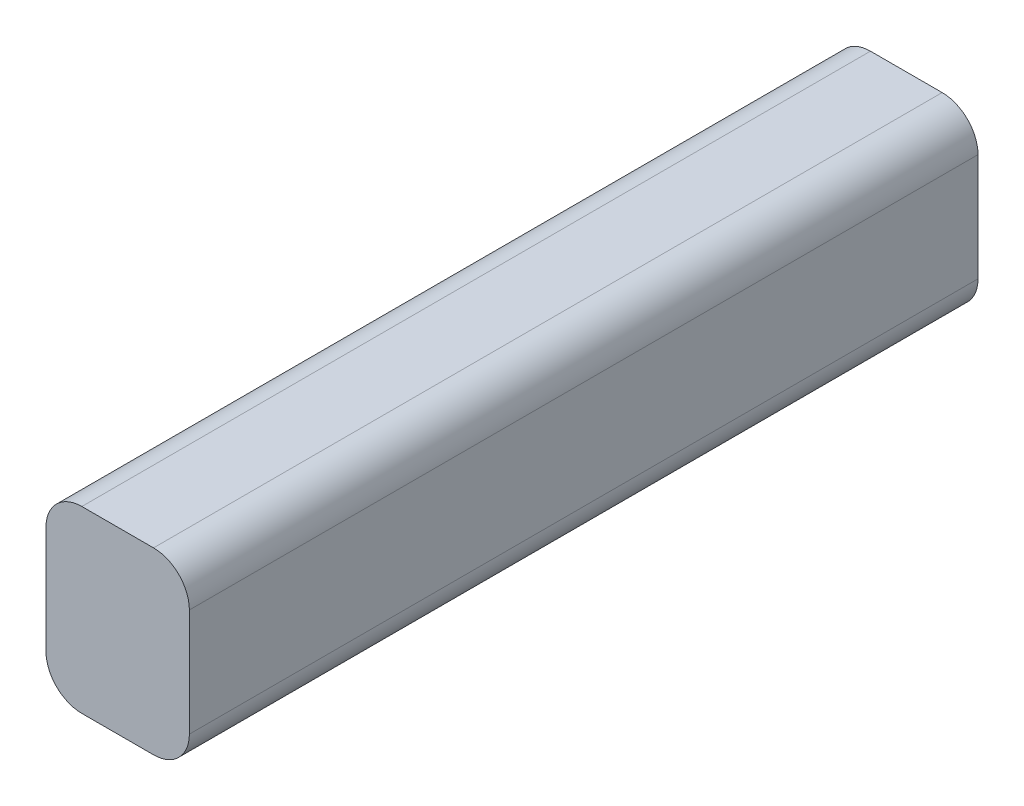
ISO-10303-21;
HEADER;
FILE_DESCRIPTION(('STEP AP214'),'2;1');
FILE_NAME('part.step','',(''),(''),'','','');
FILE_SCHEMA(('AUTOMOTIVE_DESIGN { 1 0 10303 214 1 1 1 1 }'));
ENDSEC;
DATA;
#1=APPLICATION_CONTEXT('core data for automotive mechanical design processes');
#2=APPLICATION_PROTOCOL_DEFINITION('international standard','automotive_design',2000,#1);
#3=PRODUCT_CONTEXT('',#1,'mechanical');
#4=PRODUCT('Part','Part','',(#3));
#5=PRODUCT_RELATED_PRODUCT_CATEGORY('part','',(#4));
#6=PRODUCT_DEFINITION_FORMATION('','',#4);
#7=PRODUCT_DEFINITION_CONTEXT('part definition',#1,'design');
#8=PRODUCT_DEFINITION('design','',#6,#7);
#9=PRODUCT_DEFINITION_SHAPE('','',#8);
#10=(LENGTH_UNIT() NAMED_UNIT(*) SI_UNIT(.MILLI.,.METRE.));
#11=(NAMED_UNIT(*) PLANE_ANGLE_UNIT() SI_UNIT($,.RADIAN.));
#12=(NAMED_UNIT(*) SI_UNIT($,.STERADIAN.) SOLID_ANGLE_UNIT());
#13=UNCERTAINTY_MEASURE_WITH_UNIT(LENGTH_MEASURE(1.E-05),#10,'distance_accuracy_value','');
#14=(GEOMETRIC_REPRESENTATION_CONTEXT(3) GLOBAL_UNCERTAINTY_ASSIGNED_CONTEXT((#13)) GLOBAL_UNIT_ASSIGNED_CONTEXT((#10,
#11,#12)) REPRESENTATION_CONTEXT('',''));
#15=CARTESIAN_POINT('',(0.,0.,0.));
#16=DIRECTION('',(0.,0.,1.));
#17=DIRECTION('',(1.,0.,0.));
#18=AXIS2_PLACEMENT_3D('',#15,#16,#17);
#19=CARTESIAN_POINT('',(100.,125.,1100.));
#20=DIRECTION('',(-1.,0.,0.));
#21=DIRECTION('',(0.,-1.,0.));
#22=AXIS2_PLACEMENT_3D('',#19,#20,#21);
#23=PLANE('',#22);
#24=DIRECTION('',(0.,1.,0.));
#25=VECTOR('',#24,1.);
#26=CARTESIAN_POINT('',(100.,125.,1100.));
#27=LINE('',#26,#25);
#28=CARTESIAN_POINT('',(100.,-75.,1100.));
#29=VERTEX_POINT('',#28);
#30=CARTESIAN_POINT('',(100.,75.0000000000001,1100.));
#31=VERTEX_POINT('',#30);
#32=EDGE_CURVE('E127',#29,#31,#27,.T.);
#33=ORIENTED_EDGE('',*,*,#32,.F.);
#34=DIRECTION('',(0.,0.,-1.));
#35=VECTOR('',#34,1.);
#36=CARTESIAN_POINT('',(100.,-75.,1100.));
#37=LINE('',#36,#35);
#38=CARTESIAN_POINT('',(100.,-75.,0.));
#39=VERTEX_POINT('',#38);
#40=EDGE_CURVE('E155',#29,#39,#37,.T.);
#41=ORIENTED_EDGE('',*,*,#40,.T.);
#42=DIRECTION('',(0.,1.,0.));
#43=VECTOR('',#42,1.);
#44=CARTESIAN_POINT('',(100.,125.,0.));
#45=LINE('',#44,#43);
#46=CARTESIAN_POINT('',(100.,75.0000000000001,0.));
#47=VERTEX_POINT('',#46);
#48=EDGE_CURVE('E129',#39,#47,#45,.T.);
#49=ORIENTED_EDGE('',*,*,#48,.T.);
#50=DIRECTION('',(0.,0.,-1.));
#51=VECTOR('',#50,1.);
#52=CARTESIAN_POINT('',(100.,75.0000000000001,1100.));
#53=LINE('',#52,#51);
#54=EDGE_CURVE('E150',#47,#31,#53,.F.);
#55=ORIENTED_EDGE('',*,*,#54,.T.);
#56=EDGE_LOOP('',(#33,#41,#49,#55));
#57=FACE_BOUND('',#56,.T.);
#58=ADVANCED_FACE('F36',(#57),#23,.F.);
#59=CARTESIAN_POINT('',(-100.,125.,1100.));
#60=DIRECTION('',(0.,-1.,0.));
#61=DIRECTION('',(0.,0.,-1.));
#62=AXIS2_PLACEMENT_3D('',#59,#60,#61);
#63=PLANE('',#62);
#64=DIRECTION('',(-1.,0.,0.));
#65=VECTOR('',#64,1.);
#66=CARTESIAN_POINT('',(-100.,125.,1100.));
#67=LINE('',#66,#65);
#68=CARTESIAN_POINT('',(50.,125.,1100.));
#69=VERTEX_POINT('',#68);
#70=CARTESIAN_POINT('',(-50.,125.,1100.));
#71=VERTEX_POINT('',#70);
#72=EDGE_CURVE('E167',#69,#71,#67,.T.);
#73=ORIENTED_EDGE('',*,*,#72,.F.);
#74=DIRECTION('',(0.,0.,-1.));
#75=VECTOR('',#74,1.);
#76=CARTESIAN_POINT('',(50.,125.,1100.));
#77=LINE('',#76,#75);
#78=CARTESIAN_POINT('',(50.,125.,0.));
#79=VERTEX_POINT('',#78);
#80=EDGE_CURVE('E144',#69,#79,#77,.T.);
#81=ORIENTED_EDGE('',*,*,#80,.T.);
#82=DIRECTION('',(-1.,0.,0.));
#83=VECTOR('',#82,1.);
#84=CARTESIAN_POINT('',(-100.,125.,0.));
#85=LINE('',#84,#83);
#86=CARTESIAN_POINT('',(-50.,125.,0.));
#87=VERTEX_POINT('',#86);
#88=EDGE_CURVE('E125',#79,#87,#85,.T.);
#89=ORIENTED_EDGE('',*,*,#88,.T.);
#90=DIRECTION('',(0.,0.,-1.));
#91=VECTOR('',#90,1.);
#92=CARTESIAN_POINT('',(-50.,125.,1100.));
#93=LINE('',#92,#91);
#94=EDGE_CURVE('E108',#87,#71,#93,.F.);
#95=ORIENTED_EDGE('',*,*,#94,.T.);
#96=EDGE_LOOP('',(#73,#81,#89,#95));
#97=FACE_BOUND('',#96,.T.);
#98=ADVANCED_FACE('F177',(#97),#63,.F.);
#99=CARTESIAN_POINT('',(-100.,125.,1100.));
#100=DIRECTION('',(1.,0.,0.));
#101=DIRECTION('',(0.,1.,0.));
#102=AXIS2_PLACEMENT_3D('',#99,#100,#101);
#103=PLANE('',#102);
#104=DIRECTION('',(0.,-1.,0.));
#105=VECTOR('',#104,1.);
#106=CARTESIAN_POINT('',(-100.,125.,0.));
#107=LINE('',#106,#105);
#108=CARTESIAN_POINT('',(-100.,75.0000000000001,0.));
#109=VERTEX_POINT('',#108);
#110=CARTESIAN_POINT('',(-100.,-75.,0.));
#111=VERTEX_POINT('',#110);
#112=EDGE_CURVE('E116',#109,#111,#107,.T.);
#113=ORIENTED_EDGE('',*,*,#112,.T.);
#114=DIRECTION('',(0.,0.,-1.));
#115=VECTOR('',#114,1.);
#116=CARTESIAN_POINT('',(-100.,-75.,1100.));
#117=LINE('',#116,#115);
#118=CARTESIAN_POINT('',(-100.,-75.,1100.));
#119=VERTEX_POINT('',#118);
#120=EDGE_CURVE('E140',#111,#119,#117,.F.);
#121=ORIENTED_EDGE('',*,*,#120,.T.);
#122=DIRECTION('',(0.,-1.,0.));
#123=VECTOR('',#122,1.);
#124=CARTESIAN_POINT('',(-100.,125.,1100.));
#125=LINE('',#124,#123);
#126=CARTESIAN_POINT('',(-100.,75.0000000000001,1100.));
#127=VERTEX_POINT('',#126);
#128=EDGE_CURVE('E119',#127,#119,#125,.T.);
#129=ORIENTED_EDGE('',*,*,#128,.F.);
#130=DIRECTION('',(0.,0.,-1.));
#131=VECTOR('',#130,1.);
#132=CARTESIAN_POINT('',(-100.,75.0000000000001,1100.));
#133=LINE('',#132,#131);
#134=EDGE_CURVE('E106',#127,#109,#133,.T.);
#135=ORIENTED_EDGE('',*,*,#134,.T.);
#136=EDGE_LOOP('',(#113,#121,#129,#135));
#137=FACE_BOUND('',#136,.T.);
#138=ADVANCED_FACE('F115',(#137),#103,.F.);
#139=CARTESIAN_POINT('',(-100.,-125.,1100.));
#140=DIRECTION('',(0.,1.,0.));
#141=DIRECTION('',(0.,0.,1.));
#142=AXIS2_PLACEMENT_3D('',#139,#140,#141);
#143=PLANE('',#142);
#144=DIRECTION('',(1.,0.,0.));
#145=VECTOR('',#144,1.);
#146=CARTESIAN_POINT('',(-100.,-125.,0.));
#147=LINE('',#146,#145);
#148=CARTESIAN_POINT('',(-50.,-125.,0.));
#149=VERTEX_POINT('',#148);
#150=CARTESIAN_POINT('',(50.,-125.,0.));
#151=VERTEX_POINT('',#150);
#152=EDGE_CURVE('E124',#149,#151,#147,.T.);
#153=ORIENTED_EDGE('',*,*,#152,.T.);
#154=DIRECTION('',(0.,0.,-1.));
#155=VECTOR('',#154,1.);
#156=CARTESIAN_POINT('',(50.,-125.,1100.));
#157=LINE('',#156,#155);
#158=CARTESIAN_POINT('',(50.,-125.,1100.));
#159=VERTEX_POINT('',#158);
#160=EDGE_CURVE('E44',#151,#159,#157,.F.);
#161=ORIENTED_EDGE('',*,*,#160,.T.);
#162=DIRECTION('',(1.,0.,0.));
#163=VECTOR('',#162,1.);
#164=CARTESIAN_POINT('',(-100.,-125.,1100.));
#165=LINE('',#164,#163);
#166=CARTESIAN_POINT('',(-50.,-125.,1100.));
#167=VERTEX_POINT('',#166);
#168=EDGE_CURVE('E120',#167,#159,#165,.T.);
#169=ORIENTED_EDGE('',*,*,#168,.F.);
#170=DIRECTION('',(0.,0.,-1.));
#171=VECTOR('',#170,1.);
#172=CARTESIAN_POINT('',(-50.,-125.,1100.));
#173=LINE('',#172,#171);
#174=EDGE_CURVE('E136',#167,#149,#173,.T.);
#175=ORIENTED_EDGE('',*,*,#174,.T.);
#176=EDGE_LOOP('',(#153,#161,#169,#175));
#177=FACE_BOUND('',#176,.T.);
#178=ADVANCED_FACE('F182',(#177),#143,.F.);
#179=CARTESIAN_POINT('',(0.,0.,1100.));
#180=DIRECTION('',(0.,0.,1.));
#181=DIRECTION('',(1.,0.,0.));
#182=AXIS2_PLACEMENT_3D('',#179,#180,#181);
#183=PLANE('',#182);
#184=ORIENTED_EDGE('',*,*,#168,.T.);
#185=CARTESIAN_POINT('',(50.,-75.,1100.));
#186=DIRECTION('',(0.,0.,1.));
#187=DIRECTION('',(1.,0.,0.));
#188=AXIS2_PLACEMENT_3D('',#185,#186,#187);
#189=CIRCLE('',#188,50.);
#190=EDGE_CURVE('E11',#159,#29,#189,.T.);
#191=ORIENTED_EDGE('',*,*,#190,.T.);
#192=ORIENTED_EDGE('',*,*,#32,.T.);
#193=CARTESIAN_POINT('',(50.,75.0000000000001,1100.));
#194=DIRECTION('',(0.,0.,1.));
#195=DIRECTION('',(1.,0.,0.));
#196=AXIS2_PLACEMENT_3D('',#193,#194,#195);
#197=CIRCLE('',#196,50.);
#198=EDGE_CURVE('E153',#31,#69,#197,.T.);
#199=ORIENTED_EDGE('',*,*,#198,.T.);
#200=ORIENTED_EDGE('',*,*,#72,.T.);
#201=CARTESIAN_POINT('',(-50.,75.0000000000001,1100.));
#202=DIRECTION('',(0.,0.,1.));
#203=DIRECTION('',(1.,0.,0.));
#204=AXIS2_PLACEMENT_3D('',#201,#202,#203);
#205=CIRCLE('',#204,50.);
#206=EDGE_CURVE('E134',#71,#127,#205,.T.);
#207=ORIENTED_EDGE('',*,*,#206,.T.);
#208=ORIENTED_EDGE('',*,*,#128,.T.);
#209=CARTESIAN_POINT('',(-50.,-75.,1100.));
#210=DIRECTION('',(0.,0.,1.));
#211=DIRECTION('',(1.,0.,0.));
#212=AXIS2_PLACEMENT_3D('',#209,#210,#211);
#213=CIRCLE('',#212,50.);
#214=EDGE_CURVE('E142',#119,#167,#213,.T.);
#215=ORIENTED_EDGE('',*,*,#214,.T.);
#216=EDGE_LOOP('',(#184,#191,#192,#199,#200,#207,#208,#215));
#217=FACE_BOUND('',#216,.T.);
#218=ADVANCED_FACE('F170',(#217),#183,.T.);
#219=CARTESIAN_POINT('',(0.,0.,0.));
#220=DIRECTION('',(0.,0.,1.));
#221=DIRECTION('',(1.,0.,0.));
#222=AXIS2_PLACEMENT_3D('',#219,#220,#221);
#223=PLANE('',#222);
#224=ORIENTED_EDGE('',*,*,#48,.F.);
#225=CARTESIAN_POINT('',(50.,-75.,0.));
#226=DIRECTION('',(0.,0.,1.));
#227=DIRECTION('',(1.,0.,0.));
#228=AXIS2_PLACEMENT_3D('',#225,#226,#227);
#229=CIRCLE('',#228,50.);
#230=EDGE_CURVE('E58',#39,#151,#229,.F.);
#231=ORIENTED_EDGE('',*,*,#230,.T.);
#232=ORIENTED_EDGE('',*,*,#152,.F.);
#233=CARTESIAN_POINT('',(-50.,-75.,0.));
#234=DIRECTION('',(0.,0.,1.));
#235=DIRECTION('',(1.,0.,0.));
#236=AXIS2_PLACEMENT_3D('',#233,#234,#235);
#237=CIRCLE('',#236,50.);
#238=EDGE_CURVE('E123',#149,#111,#237,.F.);
#239=ORIENTED_EDGE('',*,*,#238,.T.);
#240=ORIENTED_EDGE('',*,*,#112,.F.);
#241=CARTESIAN_POINT('',(-50.,75.0000000000001,0.));
#242=DIRECTION('',(0.,0.,1.));
#243=DIRECTION('',(1.,0.,0.));
#244=AXIS2_PLACEMENT_3D('',#241,#242,#243);
#245=CIRCLE('',#244,50.);
#246=EDGE_CURVE('E102',#109,#87,#245,.F.);
#247=ORIENTED_EDGE('',*,*,#246,.T.);
#248=ORIENTED_EDGE('',*,*,#88,.F.);
#249=CARTESIAN_POINT('',(50.,75.0000000000001,0.));
#250=DIRECTION('',(0.,0.,1.));
#251=DIRECTION('',(1.,0.,0.));
#252=AXIS2_PLACEMENT_3D('',#249,#250,#251);
#253=CIRCLE('',#252,50.);
#254=EDGE_CURVE('E147',#79,#47,#253,.F.);
#255=ORIENTED_EDGE('',*,*,#254,.T.);
#256=EDGE_LOOP('',(#224,#231,#232,#239,#240,#247,#248,#255));
#257=FACE_BOUND('',#256,.T.);
#258=ADVANCED_FACE('F122',(#257),#223,.F.);
#259=CARTESIAN_POINT('',(-50.,75.0000000000001,1100.));
#260=DIRECTION('',(0.,0.,-1.));
#261=DIRECTION('',(-1.,0.,0.));
#262=AXIS2_PLACEMENT_3D('',#259,#260,#261);
#263=CYLINDRICAL_SURFACE('',#262,50.);
#264=ORIENTED_EDGE('',*,*,#206,.F.);
#265=ORIENTED_EDGE('',*,*,#94,.F.);
#266=ORIENTED_EDGE('',*,*,#246,.F.);
#267=ORIENTED_EDGE('',*,*,#134,.F.);
#268=EDGE_LOOP('',(#264,#265,#266,#267));
#269=FACE_BOUND('',#268,.T.);
#270=ADVANCED_FACE('F105',(#269),#263,.T.);
#271=CARTESIAN_POINT('',(-50.,-75.,1100.));
#272=DIRECTION('',(0.,0.,-1.));
#273=DIRECTION('',(-1.,0.,0.));
#274=AXIS2_PLACEMENT_3D('',#271,#272,#273);
#275=CYLINDRICAL_SURFACE('',#274,50.);
#276=ORIENTED_EDGE('',*,*,#214,.F.);
#277=ORIENTED_EDGE('',*,*,#120,.F.);
#278=ORIENTED_EDGE('',*,*,#238,.F.);
#279=ORIENTED_EDGE('',*,*,#174,.F.);
#280=EDGE_LOOP('',(#276,#277,#278,#279));
#281=FACE_BOUND('',#280,.T.);
#282=ADVANCED_FACE('F181',(#281),#275,.T.);
#283=CARTESIAN_POINT('',(50.,75.0000000000001,1100.));
#284=DIRECTION('',(0.,0.,-1.));
#285=DIRECTION('',(-1.,0.,0.));
#286=AXIS2_PLACEMENT_3D('',#283,#284,#285);
#287=CYLINDRICAL_SURFACE('',#286,50.);
#288=ORIENTED_EDGE('',*,*,#198,.F.);
#289=ORIENTED_EDGE('',*,*,#54,.F.);
#290=ORIENTED_EDGE('',*,*,#254,.F.);
#291=ORIENTED_EDGE('',*,*,#80,.F.);
#292=EDGE_LOOP('',(#288,#289,#290,#291));
#293=FACE_BOUND('',#292,.T.);
#294=ADVANCED_FACE('F175',(#293),#287,.T.);
#295=CARTESIAN_POINT('',(50.,-75.,1100.));
#296=DIRECTION('',(0.,0.,-1.));
#297=DIRECTION('',(-1.,0.,0.));
#298=AXIS2_PLACEMENT_3D('',#295,#296,#297);
#299=CYLINDRICAL_SURFACE('',#298,50.);
#300=ORIENTED_EDGE('',*,*,#190,.F.);
#301=ORIENTED_EDGE('',*,*,#160,.F.);
#302=ORIENTED_EDGE('',*,*,#230,.F.);
#303=ORIENTED_EDGE('',*,*,#40,.F.);
#304=EDGE_LOOP('',(#300,#301,#302,#303));
#305=FACE_BOUND('',#304,.T.);
#306=ADVANCED_FACE('F38',(#305),#299,.T.);
#307=CLOSED_SHELL('',(#58,#98,#138,#178,#218,#258,#270,#282,#294,#306));
#308=MANIFOLD_SOLID_BREP('B2',#307);
#309=ADVANCED_BREP_SHAPE_REPRESENTATION('',(#18,#308),#14);
#310=SHAPE_DEFINITION_REPRESENTATION(#9,#309);
ENDSEC;
END-ISO-10303-21;
